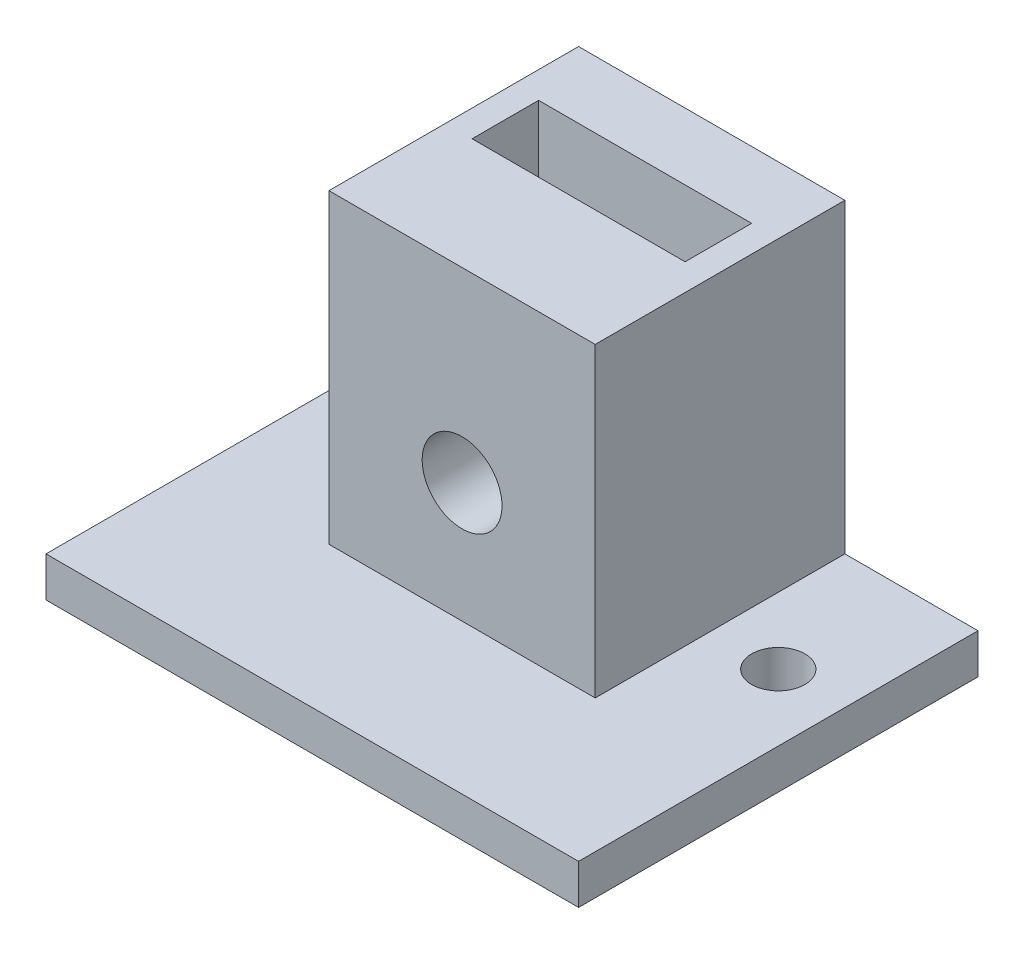
ISO-10303-21;
HEADER;
FILE_DESCRIPTION(('STEP AP214'),'2;1');
FILE_NAME('part.step','',(''),(''),'','','');
FILE_SCHEMA(('AUTOMOTIVE_DESIGN { 1 0 10303 214 1 1 1 1 }'));
ENDSEC;
DATA;
#1=APPLICATION_CONTEXT('core data for automotive mechanical design processes');
#2=APPLICATION_PROTOCOL_DEFINITION('international standard','automotive_design',2000,#1);
#3=PRODUCT_CONTEXT('',#1,'mechanical');
#4=PRODUCT('Part','Part','',(#3));
#5=PRODUCT_RELATED_PRODUCT_CATEGORY('part','',(#4));
#6=PRODUCT_DEFINITION_FORMATION('','',#4);
#7=PRODUCT_DEFINITION_CONTEXT('part definition',#1,'design');
#8=PRODUCT_DEFINITION('design','',#6,#7);
#9=PRODUCT_DEFINITION_SHAPE('','',#8);
#10=(LENGTH_UNIT() NAMED_UNIT(*) SI_UNIT(.MILLI.,.METRE.));
#11=(NAMED_UNIT(*) PLANE_ANGLE_UNIT() SI_UNIT($,.RADIAN.));
#12=(NAMED_UNIT(*) SI_UNIT($,.STERADIAN.) SOLID_ANGLE_UNIT());
#13=UNCERTAINTY_MEASURE_WITH_UNIT(LENGTH_MEASURE(1.E-05),#10,'distance_accuracy_value','');
#14=(GEOMETRIC_REPRESENTATION_CONTEXT(3) GLOBAL_UNCERTAINTY_ASSIGNED_CONTEXT((#13)) GLOBAL_UNIT_ASSIGNED_CONTEXT((#10,
#11,#12)) REPRESENTATION_CONTEXT('',''));
#15=CARTESIAN_POINT('',(0.,0.,0.));
#16=DIRECTION('',(0.,0.,1.));
#17=DIRECTION('',(1.,0.,0.));
#18=AXIS2_PLACEMENT_3D('',#15,#16,#17);
#19=CARTESIAN_POINT('',(0.,3.,-15.6296512348422));
#20=DIRECTION('',(0.,0.,-1.));
#21=DIRECTION('',(-1.,0.,0.));
#22=AXIS2_PLACEMENT_3D('',#19,#20,#21);
#23=PLANE('',#22);
#24=CARTESIAN_POINT('',(-0.051649439755044,12.,-15.6296512348422));
#25=DIRECTION('',(0.,0.,-1.));
#26=DIRECTION('',(-1.,0.,0.));
#27=AXIS2_PLACEMENT_3D('',#24,#25,#26);
#28=CIRCLE('',#27,3.);
#29=CARTESIAN_POINT('',(-3.05164943975504,12.,-15.6296512348422));
#30=VERTEX_POINT('',#29);
#31=EDGE_CURVE('E197',#30,#30,#28,.T.);
#32=ORIENTED_EDGE('',*,*,#31,.F.);
#33=EDGE_LOOP('',(#32));
#34=FACE_BOUND('',#33,.T.);
#35=DIRECTION('',(1.,0.,0.));
#36=VECTOR('',#35,1.);
#37=CARTESIAN_POINT('',(0.,0.,-15.6296512348422));
#38=LINE('',#37,#36);
#39=CARTESIAN_POINT('',(-20.051649439755,0.,-15.6296512348422));
#40=VERTEX_POINT('',#39);
#41=CARTESIAN_POINT('',(19.948350560245,0.,-15.6296512348422));
#42=VERTEX_POINT('',#41);
#43=EDGE_CURVE('E232',#40,#42,#38,.T.);
#44=ORIENTED_EDGE('',*,*,#43,.F.);
#45=DIRECTION('',(0.,-1.,0.));
#46=VECTOR('',#45,1.);
#47=CARTESIAN_POINT('',(-20.051649439755,3.,-15.6296512348422));
#48=LINE('',#47,#46);
#49=CARTESIAN_POINT('',(-20.051649439755,3.,-15.6296512348422));
#50=VERTEX_POINT('',#49);
#51=EDGE_CURVE('E12',#50,#40,#48,.T.);
#52=ORIENTED_EDGE('',*,*,#51,.F.);
#53=DIRECTION('',(1.,0.,0.));
#54=VECTOR('',#53,1.);
#55=CARTESIAN_POINT('',(0.,3.,-15.6296512348422));
#56=LINE('',#55,#54);
#57=CARTESIAN_POINT('',(-10.051649439755,3.,-15.6296512348422));
#58=VERTEX_POINT('',#57);
#59=EDGE_CURVE('E233',#50,#58,#56,.T.);
#60=ORIENTED_EDGE('',*,*,#59,.T.);
#61=DIRECTION('',(0.,-1.,0.));
#62=VECTOR('',#61,1.);
#63=CARTESIAN_POINT('',(-10.051649439755,20.,-15.6296512348422));
#64=LINE('',#63,#62);
#65=CARTESIAN_POINT('',(-10.051649439755,26.,-15.6296512348422));
#66=VERTEX_POINT('',#65);
#67=EDGE_CURVE('E226',#66,#58,#64,.T.);
#68=ORIENTED_EDGE('',*,*,#67,.F.);
#69=DIRECTION('',(-1.,0.,0.));
#70=VECTOR('',#69,1.);
#71=CARTESIAN_POINT('',(9.94835056024496,26.,-15.6296512348422));
#72=LINE('',#71,#70);
#73=CARTESIAN_POINT('',(9.94835056024496,26.,-15.6296512348422));
#74=VERTEX_POINT('',#73);
#75=EDGE_CURVE('E188',#74,#66,#72,.T.);
#76=ORIENTED_EDGE('',*,*,#75,.F.);
#77=DIRECTION('',(0.,-1.,0.));
#78=VECTOR('',#77,1.);
#79=CARTESIAN_POINT('',(9.94835056024496,20.,-15.6296512348422));
#80=LINE('',#79,#78);
#81=CARTESIAN_POINT('',(9.94835056024496,3.,-15.6296512348422));
#82=VERTEX_POINT('',#81);
#83=EDGE_CURVE('E228',#74,#82,#80,.T.);
#84=ORIENTED_EDGE('',*,*,#83,.T.);
#85=CARTESIAN_POINT('',(19.948350560245,3.,-15.6296512348422));
#86=VERTEX_POINT('',#85);
#87=EDGE_CURVE('E85',#82,#86,#56,.T.);
#88=ORIENTED_EDGE('',*,*,#87,.T.);
#89=DIRECTION('',(0.,-1.,0.));
#90=VECTOR('',#89,1.);
#91=CARTESIAN_POINT('',(19.948350560245,3.,-15.6296512348422));
#92=LINE('',#91,#90);
#93=EDGE_CURVE('E103',#86,#42,#92,.T.);
#94=ORIENTED_EDGE('',*,*,#93,.T.);
#95=EDGE_LOOP('',(#44,#52,#60,#68,#76,#84,#88,#94));
#96=FACE_BOUND('',#95,.T.);
#97=ADVANCED_FACE('F61',(#34,#96),#23,.T.);
#98=CARTESIAN_POINT('',(-20.051649439755,3.,0.));
#99=DIRECTION('',(1.,0.,0.));
#100=DIRECTION('',(0.,0.,-1.));
#101=AXIS2_PLACEMENT_3D('',#98,#99,#100);
#102=PLANE('',#101);
#103=DIRECTION('',(0.,0.,1.));
#104=VECTOR('',#103,1.);
#105=CARTESIAN_POINT('',(-20.051649439755,0.,0.));
#106=LINE('',#105,#104);
#107=CARTESIAN_POINT('',(-20.051649439755,0.,14.3703487651578));
#108=VERTEX_POINT('',#107);
#109=EDGE_CURVE('E249',#40,#108,#106,.T.);
#110=ORIENTED_EDGE('',*,*,#109,.T.);
#111=DIRECTION('',(0.,-1.,0.));
#112=VECTOR('',#111,1.);
#113=CARTESIAN_POINT('',(-20.051649439755,3.,14.3703487651578));
#114=LINE('',#113,#112);
#115=CARTESIAN_POINT('',(-20.051649439755,3.,14.3703487651578));
#116=VERTEX_POINT('',#115);
#117=EDGE_CURVE('E69',#116,#108,#114,.T.);
#118=ORIENTED_EDGE('',*,*,#117,.F.);
#119=DIRECTION('',(0.,0.,1.));
#120=VECTOR('',#119,1.);
#121=CARTESIAN_POINT('',(-20.051649439755,3.,0.));
#122=LINE('',#121,#120);
#123=EDGE_CURVE('E235',#50,#116,#122,.T.);
#124=ORIENTED_EDGE('',*,*,#123,.F.);
#125=ORIENTED_EDGE('',*,*,#51,.T.);
#126=EDGE_LOOP('',(#110,#118,#124,#125));
#127=FACE_BOUND('',#126,.T.);
#128=ADVANCED_FACE('F287',(#127),#102,.F.);
#129=CARTESIAN_POINT('',(0.,3.,14.3703487651578));
#130=DIRECTION('',(0.,0.,-1.));
#131=DIRECTION('',(-1.,0.,0.));
#132=AXIS2_PLACEMENT_3D('',#129,#130,#131);
#133=PLANE('',#132);
#134=DIRECTION('',(1.,0.,0.));
#135=VECTOR('',#134,1.);
#136=CARTESIAN_POINT('',(0.,0.,14.3703487651578));
#137=LINE('',#136,#135);
#138=CARTESIAN_POINT('',(19.948350560245,0.,14.3703487651578));
#139=VERTEX_POINT('',#138);
#140=EDGE_CURVE('E251',#108,#139,#137,.T.);
#141=ORIENTED_EDGE('',*,*,#140,.T.);
#142=DIRECTION('',(0.,-1.,0.));
#143=VECTOR('',#142,1.);
#144=CARTESIAN_POINT('',(19.948350560245,3.,14.3703487651578));
#145=LINE('',#144,#143);
#146=CARTESIAN_POINT('',(19.948350560245,3.,14.3703487651578));
#147=VERTEX_POINT('',#146);
#148=EDGE_CURVE('E264',#147,#139,#145,.T.);
#149=ORIENTED_EDGE('',*,*,#148,.F.);
#150=DIRECTION('',(1.,0.,0.));
#151=VECTOR('',#150,1.);
#152=CARTESIAN_POINT('',(0.,3.,14.3703487651578));
#153=LINE('',#152,#151);
#154=EDGE_CURVE('E237',#116,#147,#153,.T.);
#155=ORIENTED_EDGE('',*,*,#154,.F.);
#156=ORIENTED_EDGE('',*,*,#117,.T.);
#157=EDGE_LOOP('',(#141,#149,#155,#156));
#158=FACE_BOUND('',#157,.T.);
#159=ADVANCED_FACE('F271',(#158),#133,.F.);
#160=CARTESIAN_POINT('',(-15.051649439755,3.,-5.62965123484221));
#161=DIRECTION('',(0.,-1.,0.));
#162=DIRECTION('',(0.,0.,-1.));
#163=AXIS2_PLACEMENT_3D('',#160,#161,#162);
#164=CYLINDRICAL_SURFACE('',#163,2.);
#165=CARTESIAN_POINT('',(-15.051649439755,3.,-5.62965123484221));
#166=DIRECTION('',(0.,1.,0.));
#167=DIRECTION('',(0.,0.,1.));
#168=AXIS2_PLACEMENT_3D('',#165,#166,#167);
#169=CIRCLE('',#168,2.);
#170=CARTESIAN_POINT('',(-15.051649439755,3.,-3.62965123484221));
#171=VERTEX_POINT('',#170);
#172=EDGE_CURVE('E242',#171,#171,#169,.T.);
#173=ORIENTED_EDGE('',*,*,#172,.T.);
#174=EDGE_LOOP('',(#173));
#175=FACE_BOUND('',#174,.T.);
#176=CARTESIAN_POINT('',(-15.051649439755,0.,-5.62965123484221));
#177=DIRECTION('',(0.,1.,0.));
#178=DIRECTION('',(0.,0.,1.));
#179=AXIS2_PLACEMENT_3D('',#176,#177,#178);
#180=CIRCLE('',#179,2.);
#181=CARTESIAN_POINT('',(-15.051649439755,0.,-3.62965123484221));
#182=VERTEX_POINT('',#181);
#183=EDGE_CURVE('E257',#182,#182,#180,.T.);
#184=ORIENTED_EDGE('',*,*,#183,.F.);
#185=EDGE_LOOP('',(#184));
#186=FACE_BOUND('',#185,.T.);
#187=ADVANCED_FACE('F292',(#175,#186),#164,.F.);
#188=CARTESIAN_POINT('',(19.948350560245,3.,0.));
#189=DIRECTION('',(1.,0.,0.));
#190=DIRECTION('',(0.,0.,-1.));
#191=AXIS2_PLACEMENT_3D('',#188,#189,#190);
#192=PLANE('',#191);
#193=DIRECTION('',(0.,0.,1.));
#194=VECTOR('',#193,1.);
#195=CARTESIAN_POINT('',(19.948350560245,0.,0.));
#196=LINE('',#195,#194);
#197=EDGE_CURVE('E254',#42,#139,#196,.T.);
#198=ORIENTED_EDGE('',*,*,#197,.F.);
#199=ORIENTED_EDGE('',*,*,#93,.F.);
#200=DIRECTION('',(0.,0.,1.));
#201=VECTOR('',#200,1.);
#202=CARTESIAN_POINT('',(19.948350560245,3.,0.));
#203=LINE('',#202,#201);
#204=EDGE_CURVE('E239',#86,#147,#203,.T.);
#205=ORIENTED_EDGE('',*,*,#204,.T.);
#206=ORIENTED_EDGE('',*,*,#148,.T.);
#207=EDGE_LOOP('',(#198,#199,#205,#206));
#208=FACE_BOUND('',#207,.T.);
#209=ADVANCED_FACE('F280',(#208),#192,.T.);
#210=CARTESIAN_POINT('',(14.948350560245,3.,-5.62965123484221));
#211=DIRECTION('',(0.,-1.,0.));
#212=DIRECTION('',(0.,0.,-1.));
#213=AXIS2_PLACEMENT_3D('',#210,#211,#212);
#214=CYLINDRICAL_SURFACE('',#213,2.);
#215=CARTESIAN_POINT('',(14.948350560245,3.,-5.62965123484221));
#216=DIRECTION('',(0.,1.,0.));
#217=DIRECTION('',(0.,0.,1.));
#218=AXIS2_PLACEMENT_3D('',#215,#216,#217);
#219=CIRCLE('',#218,2.);
#220=CARTESIAN_POINT('',(14.948350560245,3.,-3.62965123484221));
#221=VERTEX_POINT('',#220);
#222=EDGE_CURVE('E245',#221,#221,#219,.T.);
#223=ORIENTED_EDGE('',*,*,#222,.T.);
#224=EDGE_LOOP('',(#223));
#225=FACE_BOUND('',#224,.T.);
#226=CARTESIAN_POINT('',(14.948350560245,0.,-5.62965123484221));
#227=DIRECTION('',(0.,1.,0.));
#228=DIRECTION('',(0.,0.,1.));
#229=AXIS2_PLACEMENT_3D('',#226,#227,#228);
#230=CIRCLE('',#229,2.);
#231=CARTESIAN_POINT('',(14.948350560245,0.,-3.62965123484221));
#232=VERTEX_POINT('',#231);
#233=EDGE_CURVE('E260',#232,#232,#230,.T.);
#234=ORIENTED_EDGE('',*,*,#233,.F.);
#235=EDGE_LOOP('',(#234));
#236=FACE_BOUND('',#235,.T.);
#237=ADVANCED_FACE('F299',(#225,#236),#214,.F.);
#238=CARTESIAN_POINT('',(0.,3.,0.));
#239=DIRECTION('',(0.,1.,0.));
#240=DIRECTION('',(0.,0.,1.));
#241=AXIS2_PLACEMENT_3D('',#238,#239,#240);
#242=PLANE('',#241);
#243=DIRECTION('',(0.,0.,1.));
#244=VECTOR('',#243,1.);
#245=CARTESIAN_POINT('',(-10.051649439755,3.,0.));
#246=LINE('',#245,#244);
#247=CARTESIAN_POINT('',(-10.051649439755,3.,3.12034876515778));
#248=VERTEX_POINT('',#247);
#249=EDGE_CURVE('E222',#58,#248,#246,.T.);
#250=ORIENTED_EDGE('',*,*,#249,.F.);
#251=ORIENTED_EDGE('',*,*,#59,.F.);
#252=ORIENTED_EDGE('',*,*,#123,.T.);
#253=ORIENTED_EDGE('',*,*,#154,.T.);
#254=ORIENTED_EDGE('',*,*,#204,.F.);
#255=ORIENTED_EDGE('',*,*,#87,.F.);
#256=DIRECTION('',(0.,0.,1.));
#257=VECTOR('',#256,1.);
#258=CARTESIAN_POINT('',(9.94835056024495,3.,0.));
#259=LINE('',#258,#257);
#260=CARTESIAN_POINT('',(9.94835056024495,3.,3.12034876515778));
#261=VERTEX_POINT('',#260);
#262=EDGE_CURVE('E219',#82,#261,#259,.T.);
#263=ORIENTED_EDGE('',*,*,#262,.T.);
#264=DIRECTION('',(1.,0.,0.));
#265=VECTOR('',#264,1.);
#266=CARTESIAN_POINT('',(0.,3.,3.12034876515778));
#267=LINE('',#266,#265);
#268=EDGE_CURVE('E76',#248,#261,#267,.T.);
#269=ORIENTED_EDGE('',*,*,#268,.F.);
#270=EDGE_LOOP('',(#250,#251,#252,#253,#254,#255,#263,#269));
#271=FACE_BOUND('',#270,.T.);
#272=ORIENTED_EDGE('',*,*,#172,.F.);
#273=EDGE_LOOP('',(#272));
#274=FACE_BOUND('',#273,.T.);
#275=ORIENTED_EDGE('',*,*,#222,.F.);
#276=EDGE_LOOP('',(#275));
#277=FACE_BOUND('',#276,.T.);
#278=ADVANCED_FACE('F284',(#271,#274,#277),#242,.T.);
#279=CARTESIAN_POINT('',(0.,0.,0.));
#280=DIRECTION('',(0.,1.,0.));
#281=DIRECTION('',(0.,0.,1.));
#282=AXIS2_PLACEMENT_3D('',#279,#280,#281);
#283=PLANE('',#282);
#284=ORIENTED_EDGE('',*,*,#43,.T.);
#285=ORIENTED_EDGE('',*,*,#197,.T.);
#286=ORIENTED_EDGE('',*,*,#140,.F.);
#287=ORIENTED_EDGE('',*,*,#109,.F.);
#288=EDGE_LOOP('',(#284,#285,#286,#287));
#289=FACE_BOUND('',#288,.T.);
#290=ORIENTED_EDGE('',*,*,#183,.T.);
#291=EDGE_LOOP('',(#290));
#292=FACE_BOUND('',#291,.T.);
#293=ORIENTED_EDGE('',*,*,#233,.T.);
#294=EDGE_LOOP('',(#293));
#295=FACE_BOUND('',#294,.T.);
#296=ADVANCED_FACE('F276',(#289,#292,#295),#283,.F.);
#297=CARTESIAN_POINT('',(0.,20.,3.12034876515778));
#298=DIRECTION('',(0.,0.,-1.));
#299=DIRECTION('',(-1.,0.,0.));
#300=AXIS2_PLACEMENT_3D('',#297,#298,#299);
#301=PLANE('',#300);
#302=CARTESIAN_POINT('',(-0.051649439755044,12.,3.12034876515779));
#303=DIRECTION('',(0.,0.,-1.));
#304=DIRECTION('',(-1.,0.,0.));
#305=AXIS2_PLACEMENT_3D('',#302,#303,#304);
#306=CIRCLE('',#305,3.);
#307=CARTESIAN_POINT('',(-3.05164943975504,12.,3.12034876515779));
#308=VERTEX_POINT('',#307);
#309=EDGE_CURVE('E198',#308,#308,#306,.T.);
#310=ORIENTED_EDGE('',*,*,#309,.T.);
#311=EDGE_LOOP('',(#310));
#312=FACE_BOUND('',#311,.T.);
#313=ORIENTED_EDGE('',*,*,#268,.T.);
#314=DIRECTION('',(0.,-1.,0.));
#315=VECTOR('',#314,1.);
#316=CARTESIAN_POINT('',(9.94835056024495,20.,3.12034876515778));
#317=LINE('',#316,#315);
#318=CARTESIAN_POINT('',(9.94835056024495,26.,3.12034876515778));
#319=VERTEX_POINT('',#318);
#320=EDGE_CURVE('E230',#319,#261,#317,.T.);
#321=ORIENTED_EDGE('',*,*,#320,.F.);
#322=DIRECTION('',(1.,0.,0.));
#323=VECTOR('',#322,1.);
#324=CARTESIAN_POINT('',(-10.051649439755,26.,3.12034876515778));
#325=LINE('',#324,#323);
#326=CARTESIAN_POINT('',(-10.051649439755,26.,3.12034876515778));
#327=VERTEX_POINT('',#326);
#328=EDGE_CURVE('E194',#327,#319,#325,.T.);
#329=ORIENTED_EDGE('',*,*,#328,.F.);
#330=DIRECTION('',(0.,-1.,0.));
#331=VECTOR('',#330,1.);
#332=CARTESIAN_POINT('',(-10.051649439755,20.,3.12034876515778));
#333=LINE('',#332,#331);
#334=EDGE_CURVE('E224',#327,#248,#333,.T.);
#335=ORIENTED_EDGE('',*,*,#334,.T.);
#336=EDGE_LOOP('',(#313,#321,#329,#335));
#337=FACE_BOUND('',#336,.T.);
#338=ADVANCED_FACE('F308',(#312,#337),#301,.F.);
#339=CARTESIAN_POINT('',(9.94835056024495,20.,0.));
#340=DIRECTION('',(1.,0.,0.));
#341=DIRECTION('',(0.,0.,-1.));
#342=AXIS2_PLACEMENT_3D('',#339,#340,#341);
#343=PLANE('',#342);
#344=ORIENTED_EDGE('',*,*,#262,.F.);
#345=ORIENTED_EDGE('',*,*,#83,.F.);
#346=DIRECTION('',(0.,0.,-1.));
#347=VECTOR('',#346,1.);
#348=CARTESIAN_POINT('',(9.94835056024495,26.,3.12034876515778));
#349=LINE('',#348,#347);
#350=EDGE_CURVE('E185',#319,#74,#349,.T.);
#351=ORIENTED_EDGE('',*,*,#350,.F.);
#352=ORIENTED_EDGE('',*,*,#320,.T.);
#353=EDGE_LOOP('',(#344,#345,#351,#352));
#354=FACE_BOUND('',#353,.T.);
#355=ADVANCED_FACE('F313',(#354),#343,.T.);
#356=CARTESIAN_POINT('',(-10.051649439755,20.,0.));
#357=DIRECTION('',(1.,0.,0.));
#358=DIRECTION('',(0.,0.,-1.));
#359=AXIS2_PLACEMENT_3D('',#356,#357,#358);
#360=PLANE('',#359);
#361=ORIENTED_EDGE('',*,*,#249,.T.);
#362=ORIENTED_EDGE('',*,*,#334,.F.);
#363=DIRECTION('',(0.,0.,1.));
#364=VECTOR('',#363,1.);
#365=CARTESIAN_POINT('',(-10.051649439755,26.,-15.6296512348422));
#366=LINE('',#365,#364);
#367=EDGE_CURVE('E191',#66,#327,#366,.T.);
#368=ORIENTED_EDGE('',*,*,#367,.F.);
#369=ORIENTED_EDGE('',*,*,#67,.T.);
#370=EDGE_LOOP('',(#361,#362,#368,#369));
#371=FACE_BOUND('',#370,.T.);
#372=ADVANCED_FACE('F317',(#371),#360,.F.);
#373=CARTESIAN_POINT('',(7.94835056024496,0.,-5.62965123484221));
#374=DIRECTION('',(-1.,0.,0.));
#375=DIRECTION('',(0.,0.,1.));
#376=AXIS2_PLACEMENT_3D('',#373,#374,#375);
#377=PLANE('',#376);
#378=DIRECTION('',(0.,1.,0.));
#379=VECTOR('',#378,1.);
#380=CARTESIAN_POINT('',(7.94835056024496,0.,-10.6296512348422));
#381=LINE('',#380,#379);
#382=CARTESIAN_POINT('',(7.94835056024496,12.,-10.6296512348422));
#383=VERTEX_POINT('',#382);
#384=CARTESIAN_POINT('',(7.94835056024496,26.,-10.6296512348422));
#385=VERTEX_POINT('',#384);
#386=EDGE_CURVE('E156',#383,#385,#381,.T.);
#387=ORIENTED_EDGE('',*,*,#386,.F.);
#388=DIRECTION('',(0.,0.,-1.));
#389=VECTOR('',#388,1.);
#390=CARTESIAN_POINT('',(7.94835056024496,12.,-5.62965123484221));
#391=LINE('',#390,#389);
#392=CARTESIAN_POINT('',(7.94835056024496,12.,-5.62965123484221));
#393=VERTEX_POINT('',#392);
#394=EDGE_CURVE('E211',#393,#383,#391,.T.);
#395=ORIENTED_EDGE('',*,*,#394,.F.);
#396=DIRECTION('',(0.,1.,0.));
#397=VECTOR('',#396,1.);
#398=CARTESIAN_POINT('',(7.94835056024496,0.,-5.62965123484221));
#399=LINE('',#398,#397);
#400=CARTESIAN_POINT('',(7.94835056024496,26.,-5.62965123484221));
#401=VERTEX_POINT('',#400);
#402=EDGE_CURVE('E172',#393,#401,#399,.T.);
#403=ORIENTED_EDGE('',*,*,#402,.T.);
#404=DIRECTION('',(0.,0.,-1.));
#405=VECTOR('',#404,1.);
#406=CARTESIAN_POINT('',(7.94835056024496,26.,-5.62965123484221));
#407=LINE('',#406,#405);
#408=EDGE_CURVE('E169',#401,#385,#407,.T.);
#409=ORIENTED_EDGE('',*,*,#408,.T.);
#410=EDGE_LOOP('',(#387,#395,#403,#409));
#411=FACE_BOUND('',#410,.T.);
#412=ADVANCED_FACE('F170',(#411),#377,.T.);
#413=CARTESIAN_POINT('',(-8.05164943975504,0.,-5.62965123484221));
#414=DIRECTION('',(1.,0.,0.));
#415=DIRECTION('',(0.,0.,-1.));
#416=AXIS2_PLACEMENT_3D('',#413,#414,#415);
#417=PLANE('',#416);
#418=DIRECTION('',(0.,-1.,0.));
#419=VECTOR('',#418,1.);
#420=CARTESIAN_POINT('',(-8.05164943975504,0.,-10.6296512348422));
#421=LINE('',#420,#419);
#422=CARTESIAN_POINT('',(-8.05164943975504,26.,-10.6296512348422));
#423=VERTEX_POINT('',#422);
#424=CARTESIAN_POINT('',(-8.05164943975504,12.,-10.6296512348422));
#425=VERTEX_POINT('',#424);
#426=EDGE_CURVE('E207',#423,#425,#421,.T.);
#427=ORIENTED_EDGE('',*,*,#426,.F.);
#428=DIRECTION('',(0.,0.,1.));
#429=VECTOR('',#428,1.);
#430=CARTESIAN_POINT('',(-8.05164943975504,26.,-10.6296512348422));
#431=LINE('',#430,#429);
#432=CARTESIAN_POINT('',(-8.05164943975504,26.,-5.62965123484221));
#433=VERTEX_POINT('',#432);
#434=EDGE_CURVE('E179',#423,#433,#431,.T.);
#435=ORIENTED_EDGE('',*,*,#434,.T.);
#436=DIRECTION('',(0.,-1.,0.));
#437=VECTOR('',#436,1.);
#438=CARTESIAN_POINT('',(-8.05164943975504,0.,-5.62965123484221));
#439=LINE('',#438,#437);
#440=CARTESIAN_POINT('',(-8.05164943975504,12.,-5.62965123484221));
#441=VERTEX_POINT('',#440);
#442=EDGE_CURVE('E210',#433,#441,#439,.T.);
#443=ORIENTED_EDGE('',*,*,#442,.T.);
#444=DIRECTION('',(0.,0.,-1.));
#445=VECTOR('',#444,1.);
#446=CARTESIAN_POINT('',(-8.05164943975504,12.,-5.62965123484221));
#447=LINE('',#446,#445);
#448=EDGE_CURVE('E215',#441,#425,#447,.T.);
#449=ORIENTED_EDGE('',*,*,#448,.T.);
#450=EDGE_LOOP('',(#427,#435,#443,#449));
#451=FACE_BOUND('',#450,.T.);
#452=ADVANCED_FACE('F324',(#451),#417,.T.);
#453=CARTESIAN_POINT('',(-0.051649439755044,12.,-5.62965123484221));
#454=DIRECTION('',(0.,0.,-1.));
#455=DIRECTION('',(-1.,0.,0.));
#456=AXIS2_PLACEMENT_3D('',#453,#454,#455);
#457=CYLINDRICAL_SURFACE('',#456,8.);
#458=CARTESIAN_POINT('',(-0.051649439755044,12.,-10.6296512348422));
#459=DIRECTION('',(0.,0.,-1.));
#460=DIRECTION('',(-1.,0.,0.));
#461=AXIS2_PLACEMENT_3D('',#458,#459,#460);
#462=CIRCLE('',#461,8.);
#463=EDGE_CURVE('E164',#383,#425,#462,.T.);
#464=ORIENTED_EDGE('',*,*,#463,.T.);
#465=ORIENTED_EDGE('',*,*,#448,.F.);
#466=CARTESIAN_POINT('',(-0.051649439755044,12.,-5.62965123484221));
#467=DIRECTION('',(0.,0.,-1.));
#468=DIRECTION('',(-1.,0.,0.));
#469=AXIS2_PLACEMENT_3D('',#466,#467,#468);
#470=CIRCLE('',#469,8.);
#471=EDGE_CURVE('E206',#393,#441,#470,.T.);
#472=ORIENTED_EDGE('',*,*,#471,.F.);
#473=ORIENTED_EDGE('',*,*,#394,.T.);
#474=EDGE_LOOP('',(#464,#465,#472,#473));
#475=FACE_BOUND('',#474,.T.);
#476=ADVANCED_FACE('F325',(#475),#457,.F.);
#477=CARTESIAN_POINT('',(0.,0.,-5.62965123484221));
#478=DIRECTION('',(0.,0.,-1.));
#479=DIRECTION('',(-1.,0.,0.));
#480=AXIS2_PLACEMENT_3D('',#477,#478,#479);
#481=PLANE('',#480);
#482=CARTESIAN_POINT('',(-0.051649439755044,12.,-5.62965123484221));
#483=DIRECTION('',(0.,0.,-1.));
#484=DIRECTION('',(-1.,0.,0.));
#485=AXIS2_PLACEMENT_3D('',#482,#483,#484);
#486=CIRCLE('',#485,3.);
#487=CARTESIAN_POINT('',(-3.05164943975504,12.,-5.62965123484221));
#488=VERTEX_POINT('',#487);
#489=EDGE_CURVE('E166',#488,#488,#486,.T.);
#490=ORIENTED_EDGE('',*,*,#489,.F.);
#491=EDGE_LOOP('',(#490));
#492=FACE_BOUND('',#491,.T.);
#493=ORIENTED_EDGE('',*,*,#402,.F.);
#494=ORIENTED_EDGE('',*,*,#471,.T.);
#495=ORIENTED_EDGE('',*,*,#442,.F.);
#496=DIRECTION('',(1.,0.,0.));
#497=VECTOR('',#496,1.);
#498=CARTESIAN_POINT('',(-8.05164943975504,26.,-5.62965123484221));
#499=LINE('',#498,#497);
#500=EDGE_CURVE('E181',#433,#401,#499,.T.);
#501=ORIENTED_EDGE('',*,*,#500,.T.);
#502=EDGE_LOOP('',(#493,#494,#495,#501));
#503=FACE_BOUND('',#502,.T.);
#504=ADVANCED_FACE('F328',(#492,#503),#481,.T.);
#505=CARTESIAN_POINT('',(0.,0.,-10.6296512348422));
#506=DIRECTION('',(0.,0.,-1.));
#507=DIRECTION('',(-1.,0.,0.));
#508=AXIS2_PLACEMENT_3D('',#505,#506,#507);
#509=PLANE('',#508);
#510=CARTESIAN_POINT('',(-0.051649439755044,12.,-10.6296512348422));
#511=DIRECTION('',(0.,0.,-1.));
#512=DIRECTION('',(-1.,0.,0.));
#513=AXIS2_PLACEMENT_3D('',#510,#511,#512);
#514=CIRCLE('',#513,3.);
#515=CARTESIAN_POINT('',(-3.05164943975504,12.,-10.6296512348422));
#516=VERTEX_POINT('',#515);
#517=EDGE_CURVE('E64',#516,#516,#514,.T.);
#518=ORIENTED_EDGE('',*,*,#517,.T.);
#519=EDGE_LOOP('',(#518));
#520=FACE_BOUND('',#519,.T.);
#521=ORIENTED_EDGE('',*,*,#386,.T.);
#522=DIRECTION('',(-1.,0.,0.));
#523=VECTOR('',#522,1.);
#524=CARTESIAN_POINT('',(7.94835056024496,26.,-10.6296512348422));
#525=LINE('',#524,#523);
#526=EDGE_CURVE('E161',#385,#423,#525,.T.);
#527=ORIENTED_EDGE('',*,*,#526,.T.);
#528=ORIENTED_EDGE('',*,*,#426,.T.);
#529=ORIENTED_EDGE('',*,*,#463,.F.);
#530=EDGE_LOOP('',(#521,#527,#528,#529));
#531=FACE_BOUND('',#530,.T.);
#532=ADVANCED_FACE('F158',(#520,#531),#509,.F.);
#533=CARTESIAN_POINT('',(-0.051649439755044,12.,3.12034876515779));
#534=DIRECTION('',(0.,0.,-1.));
#535=DIRECTION('',(-1.,0.,0.));
#536=AXIS2_PLACEMENT_3D('',#533,#534,#535);
#537=CYLINDRICAL_SURFACE('',#536,3.);
#538=ORIENTED_EDGE('',*,*,#31,.T.);
#539=EDGE_LOOP('',(#538));
#540=FACE_BOUND('',#539,.T.);
#541=ORIENTED_EDGE('',*,*,#517,.F.);
#542=EDGE_LOOP('',(#541));
#543=FACE_BOUND('',#542,.T.);
#544=ADVANCED_FACE('F335',(#540,#543),#537,.F.);
#545=ORIENTED_EDGE('',*,*,#489,.T.);
#546=EDGE_LOOP('',(#545));
#547=FACE_BOUND('',#546,.T.);
#548=ORIENTED_EDGE('',*,*,#309,.F.);
#549=EDGE_LOOP('',(#548));
#550=FACE_BOUND('',#549,.T.);
#551=ADVANCED_FACE('F340',(#547,#550),#537,.F.);
#552=CARTESIAN_POINT('',(0.,26.,0.));
#553=DIRECTION('',(0.,1.,0.));
#554=DIRECTION('',(0.,0.,1.));
#555=AXIS2_PLACEMENT_3D('',#552,#553,#554);
#556=PLANE('',#555);
#557=ORIENTED_EDGE('',*,*,#350,.T.);
#558=ORIENTED_EDGE('',*,*,#75,.T.);
#559=ORIENTED_EDGE('',*,*,#367,.T.);
#560=ORIENTED_EDGE('',*,*,#328,.T.);
#561=EDGE_LOOP('',(#557,#558,#559,#560));
#562=FACE_BOUND('',#561,.T.);
#563=ORIENTED_EDGE('',*,*,#526,.F.);
#564=ORIENTED_EDGE('',*,*,#408,.F.);
#565=ORIENTED_EDGE('',*,*,#500,.F.);
#566=ORIENTED_EDGE('',*,*,#434,.F.);
#567=EDGE_LOOP('',(#563,#564,#565,#566));
#568=FACE_BOUND('',#567,.T.);
#569=ADVANCED_FACE('F177',(#562,#568),#556,.T.);
#570=CLOSED_SHELL('',(#97,#128,#159,#187,#209,#237,#278,#296,#338,#355,#372,#412,#452,#476,#504,
#532,#544,#551,#569));
#571=MANIFOLD_SOLID_BREP('B2',#570);
#572=ADVANCED_BREP_SHAPE_REPRESENTATION('',(#18,#571),#14);
#573=SHAPE_DEFINITION_REPRESENTATION(#9,#572);
ENDSEC;
END-ISO-10303-21;
